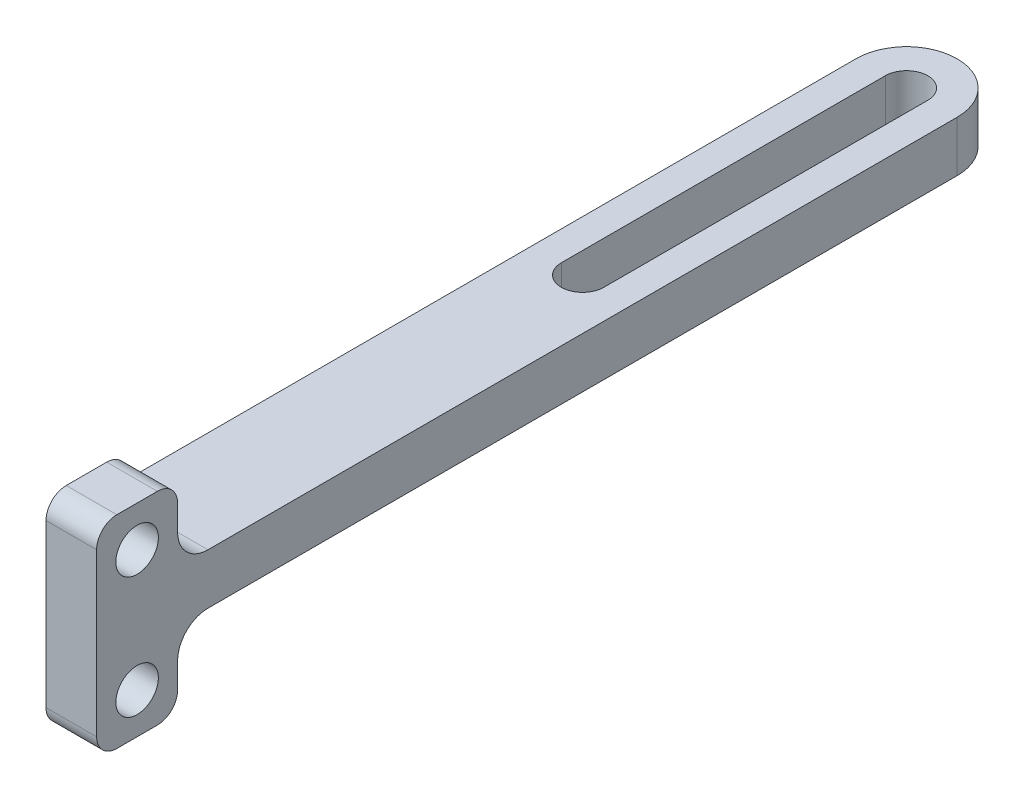
ISO-10303-21;
HEADER;
FILE_DESCRIPTION(('STEP AP214'),'2;1');
FILE_NAME('part.step','',(''),(''),'','','');
FILE_SCHEMA(('AUTOMOTIVE_DESIGN { 1 0 10303 214 1 1 1 1 }'));
ENDSEC;
DATA;
#1=APPLICATION_CONTEXT('core data for automotive mechanical design processes');
#2=APPLICATION_PROTOCOL_DEFINITION('international standard','automotive_design',2000,#1);
#3=PRODUCT_CONTEXT('',#1,'mechanical');
#4=PRODUCT('Part','Part','',(#3));
#5=PRODUCT_RELATED_PRODUCT_CATEGORY('part','',(#4));
#6=PRODUCT_DEFINITION_FORMATION('','',#4);
#7=PRODUCT_DEFINITION_CONTEXT('part definition',#1,'design');
#8=PRODUCT_DEFINITION('design','',#6,#7);
#9=PRODUCT_DEFINITION_SHAPE('','',#8);
#10=(LENGTH_UNIT() NAMED_UNIT(*) SI_UNIT(.MILLI.,.METRE.));
#11=(NAMED_UNIT(*) PLANE_ANGLE_UNIT() SI_UNIT($,.RADIAN.));
#12=(NAMED_UNIT(*) SI_UNIT($,.STERADIAN.) SOLID_ANGLE_UNIT());
#13=UNCERTAINTY_MEASURE_WITH_UNIT(LENGTH_MEASURE(1.E-05),#10,'distance_accuracy_value','');
#14=(GEOMETRIC_REPRESENTATION_CONTEXT(3) GLOBAL_UNCERTAINTY_ASSIGNED_CONTEXT((#13)) GLOBAL_UNIT_ASSIGNED_CONTEXT((#10,
#11,#12)) REPRESENTATION_CONTEXT('',''));
#15=CARTESIAN_POINT('',(0.,0.,0.));
#16=DIRECTION('',(0.,0.,1.));
#17=DIRECTION('',(1.,0.,0.));
#18=AXIS2_PLACEMENT_3D('',#15,#16,#17);
#19=CARTESIAN_POINT('',(-5.,5.,0.));
#20=DIRECTION('',(1.,0.,0.));
#21=DIRECTION('',(0.,0.,-1.));
#22=AXIS2_PLACEMENT_3D('',#19,#20,#21);
#23=PLANE('',#22);
#24=DIRECTION('',(0.,0.,1.));
#25=VECTOR('',#24,1.);
#26=CARTESIAN_POINT('',(-5.,0.,0.));
#27=LINE('',#26,#25);
#28=CARTESIAN_POINT('',(-5.,0.,-32.));
#29=VERTEX_POINT('',#28);
#30=CARTESIAN_POINT('',(-5.,0.,39.));
#31=VERTEX_POINT('',#30);
#32=EDGE_CURVE('E280',#29,#31,#27,.T.);
#33=ORIENTED_EDGE('',*,*,#32,.T.);
#34=DIRECTION('',(0.,-1.,0.));
#35=VECTOR('',#34,1.);
#36=CARTESIAN_POINT('',(-5.,5.,39.));
#37=LINE('',#36,#35);
#38=CARTESIAN_POINT('',(-5.,5.,39.));
#39=VERTEX_POINT('',#38);
#40=EDGE_CURVE('E332',#31,#39,#37,.F.);
#41=ORIENTED_EDGE('',*,*,#40,.T.);
#42=DIRECTION('',(0.,0.,1.));
#43=VECTOR('',#42,1.);
#44=CARTESIAN_POINT('',(-5.,5.,-32.));
#45=LINE('',#44,#43);
#46=CARTESIAN_POINT('',(-5.,5.,-32.));
#47=VERTEX_POINT('',#46);
#48=EDGE_CURVE('E272',#47,#39,#45,.T.);
#49=ORIENTED_EDGE('',*,*,#48,.F.);
#50=DIRECTION('',(0.,-1.,0.));
#51=VECTOR('',#50,1.);
#52=CARTESIAN_POINT('',(-5.,5.,-32.));
#53=LINE('',#52,#51);
#54=EDGE_CURVE('E285',#47,#29,#53,.T.);
#55=ORIENTED_EDGE('',*,*,#54,.T.);
#56=EDGE_LOOP('',(#33,#41,#49,#55));
#57=FACE_BOUND('',#56,.T.);
#58=ADVANCED_FACE('F33',(#57),#23,.F.);
#59=CARTESIAN_POINT('',(0.,5.,-32.));
#60=DIRECTION('',(0.,1.,0.));
#61=DIRECTION('',(0.,0.,1.));
#62=AXIS2_PLACEMENT_3D('',#59,#60,#61);
#63=PLANE('',#62);
#64=ORIENTED_EDGE('',*,*,#48,.T.);
#65=CARTESIAN_POINT('',(-2.,5.,39.));
#66=DIRECTION('',(0.,1.,0.));
#67=DIRECTION('',(0.,0.,1.));
#68=AXIS2_PLACEMENT_3D('',#65,#66,#67);
#69=CIRCLE('',#68,3.);
#70=CARTESIAN_POINT('',(-2.,5.,42.));
#71=VERTEX_POINT('',#70);
#72=EDGE_CURVE('E202',#39,#71,#69,.T.);
#73=ORIENTED_EDGE('',*,*,#72,.T.);
#74=DIRECTION('',(-1.,0.,0.));
#75=VECTOR('',#74,1.);
#76=CARTESIAN_POINT('',(-4.99999999999999,5.,42.));
#77=LINE('',#76,#75);
#78=CARTESIAN_POINT('',(0.,5.,42.));
#79=VERTEX_POINT('',#78);
#80=EDGE_CURVE('E192',#79,#71,#77,.T.);
#81=ORIENTED_EDGE('',*,*,#80,.F.);
#82=DIRECTION('',(1.,0.,0.));
#83=VECTOR('',#82,1.);
#84=CARTESIAN_POINT('',(5.,5.,42.));
#85=LINE('',#84,#83);
#86=CARTESIAN_POINT('',(5.,5.,42.));
#87=VERTEX_POINT('',#86);
#88=EDGE_CURVE('E334',#79,#87,#85,.T.);
#89=ORIENTED_EDGE('',*,*,#88,.T.);
#90=DIRECTION('',(0.,0.,-1.));
#91=VECTOR('',#90,1.);
#92=CARTESIAN_POINT('',(5.,5.,45.));
#93=LINE('',#92,#91);
#94=CARTESIAN_POINT('',(5.,5.,-32.));
#95=VERTEX_POINT('',#94);
#96=EDGE_CURVE('E275',#87,#95,#93,.T.);
#97=ORIENTED_EDGE('',*,*,#96,.T.);
#98=CARTESIAN_POINT('',(0.,5.,-32.));
#99=DIRECTION('',(0.,1.,0.));
#100=DIRECTION('',(0.,0.,1.));
#101=AXIS2_PLACEMENT_3D('',#98,#99,#100);
#102=CIRCLE('',#101,5.);
#103=EDGE_CURVE('E269',#95,#47,#102,.T.);
#104=ORIENTED_EDGE('',*,*,#103,.T.);
#105=EDGE_LOOP('',(#64,#73,#81,#89,#97,#104));
#106=FACE_BOUND('',#105,.T.);
#107=DIRECTION('',(0.,0.,1.));
#108=VECTOR('',#107,1.);
#109=CARTESIAN_POINT('',(-2.1,5.,-32.));
#110=LINE('',#109,#108);
#111=CARTESIAN_POINT('',(-2.1,5.,-32.));
#112=VERTEX_POINT('',#111);
#113=CARTESIAN_POINT('',(-2.1,5.,0.));
#114=VERTEX_POINT('',#113);
#115=EDGE_CURVE('E240',#112,#114,#110,.T.);
#116=ORIENTED_EDGE('',*,*,#115,.F.);
#117=CARTESIAN_POINT('',(0.,5.,-32.));
#118=DIRECTION('',(0.,1.,0.));
#119=DIRECTION('',(0.,0.,1.));
#120=AXIS2_PLACEMENT_3D('',#117,#118,#119);
#121=CIRCLE('',#120,2.1);
#122=CARTESIAN_POINT('',(2.1,5.,-32.));
#123=VERTEX_POINT('',#122);
#124=EDGE_CURVE('E238',#123,#112,#121,.T.);
#125=ORIENTED_EDGE('',*,*,#124,.F.);
#126=DIRECTION('',(0.,0.,-1.));
#127=VECTOR('',#126,1.);
#128=CARTESIAN_POINT('',(2.1,5.,-32.));
#129=LINE('',#128,#127);
#130=CARTESIAN_POINT('',(2.1,5.,0.));
#131=VERTEX_POINT('',#130);
#132=EDGE_CURVE('E246',#131,#123,#129,.T.);
#133=ORIENTED_EDGE('',*,*,#132,.F.);
#134=CARTESIAN_POINT('',(0.,5.,0.));
#135=DIRECTION('',(0.,1.,0.));
#136=DIRECTION('',(0.,0.,1.));
#137=AXIS2_PLACEMENT_3D('',#134,#135,#136);
#138=CIRCLE('',#137,2.1);
#139=EDGE_CURVE('E243',#114,#131,#138,.T.);
#140=ORIENTED_EDGE('',*,*,#139,.F.);
#141=EDGE_LOOP('',(#116,#125,#133,#140));
#142=FACE_BOUND('',#141,.T.);
#143=ADVANCED_FACE('F338',(#106,#142),#63,.T.);
#144=CARTESIAN_POINT('',(0.,0.,-32.));
#145=DIRECTION('',(0.,1.,0.));
#146=DIRECTION('',(0.,0.,1.));
#147=AXIS2_PLACEMENT_3D('',#144,#145,#146);
#148=PLANE('',#147);
#149=DIRECTION('',(1.,0.,0.));
#150=VECTOR('',#149,1.);
#151=CARTESIAN_POINT('',(-4.99999999999999,0.,42.));
#152=LINE('',#151,#150);
#153=CARTESIAN_POINT('',(-2.,0.,42.));
#154=VERTEX_POINT('',#153);
#155=CARTESIAN_POINT('',(0.,0.,42.));
#156=VERTEX_POINT('',#155);
#157=EDGE_CURVE('E173',#154,#156,#152,.T.);
#158=ORIENTED_EDGE('',*,*,#157,.F.);
#159=CARTESIAN_POINT('',(-2.,0.,39.));
#160=DIRECTION('',(0.,1.,0.));
#161=DIRECTION('',(0.,0.,1.));
#162=AXIS2_PLACEMENT_3D('',#159,#160,#161);
#163=CIRCLE('',#162,3.);
#164=EDGE_CURVE('E176',#154,#31,#163,.F.);
#165=ORIENTED_EDGE('',*,*,#164,.T.);
#166=ORIENTED_EDGE('',*,*,#32,.F.);
#167=CARTESIAN_POINT('',(0.,0.,-32.));
#168=DIRECTION('',(0.,1.,0.));
#169=DIRECTION('',(0.,0.,1.));
#170=AXIS2_PLACEMENT_3D('',#167,#168,#169);
#171=CIRCLE('',#170,5.);
#172=CARTESIAN_POINT('',(5.,0.,-32.));
#173=VERTEX_POINT('',#172);
#174=EDGE_CURVE('E268',#173,#29,#171,.T.);
#175=ORIENTED_EDGE('',*,*,#174,.F.);
#176=DIRECTION('',(0.,0.,-1.));
#177=VECTOR('',#176,1.);
#178=CARTESIAN_POINT('',(5.,0.,-32.));
#179=LINE('',#178,#177);
#180=CARTESIAN_POINT('',(5.,0.,42.));
#181=VERTEX_POINT('',#180);
#182=EDGE_CURVE('E175',#181,#173,#179,.T.);
#183=ORIENTED_EDGE('',*,*,#182,.F.);
#184=DIRECTION('',(1.,0.,0.));
#185=VECTOR('',#184,1.);
#186=CARTESIAN_POINT('',(0.,0.,42.));
#187=LINE('',#186,#185);
#188=EDGE_CURVE('E169',#181,#156,#187,.F.);
#189=ORIENTED_EDGE('',*,*,#188,.T.);
#190=EDGE_LOOP('',(#158,#165,#166,#175,#183,#189));
#191=FACE_BOUND('',#190,.T.);
#192=CARTESIAN_POINT('',(0.,0.,-32.));
#193=DIRECTION('',(0.,1.,0.));
#194=DIRECTION('',(0.,0.,1.));
#195=AXIS2_PLACEMENT_3D('',#192,#193,#194);
#196=CIRCLE('',#195,2.1);
#197=CARTESIAN_POINT('',(2.1,0.,-32.));
#198=VERTEX_POINT('',#197);
#199=CARTESIAN_POINT('',(-2.1,0.,-32.));
#200=VERTEX_POINT('',#199);
#201=EDGE_CURVE('E237',#198,#200,#196,.T.);
#202=ORIENTED_EDGE('',*,*,#201,.T.);
#203=DIRECTION('',(0.,0.,1.));
#204=VECTOR('',#203,1.);
#205=CARTESIAN_POINT('',(-2.1,0.,-32.));
#206=LINE('',#205,#204);
#207=CARTESIAN_POINT('',(-2.1,0.,0.));
#208=VERTEX_POINT('',#207);
#209=EDGE_CURVE('E251',#200,#208,#206,.T.);
#210=ORIENTED_EDGE('',*,*,#209,.T.);
#211=CARTESIAN_POINT('',(0.,0.,0.));
#212=DIRECTION('',(0.,1.,0.));
#213=DIRECTION('',(0.,0.,1.));
#214=AXIS2_PLACEMENT_3D('',#211,#212,#213);
#215=CIRCLE('',#214,2.1);
#216=CARTESIAN_POINT('',(2.1,0.,0.));
#217=VERTEX_POINT('',#216);
#218=EDGE_CURVE('E254',#208,#217,#215,.T.);
#219=ORIENTED_EDGE('',*,*,#218,.T.);
#220=DIRECTION('',(0.,0.,-1.));
#221=VECTOR('',#220,1.);
#222=CARTESIAN_POINT('',(2.1,0.,-32.));
#223=LINE('',#222,#221);
#224=EDGE_CURVE('E241',#217,#198,#223,.T.);
#225=ORIENTED_EDGE('',*,*,#224,.T.);
#226=EDGE_LOOP('',(#202,#210,#219,#225));
#227=FACE_BOUND('',#226,.T.);
#228=ADVANCED_FACE('F171',(#191,#227),#148,.F.);
#229=CARTESIAN_POINT('',(0.,5.,-32.));
#230=DIRECTION('',(0.,-1.,0.));
#231=DIRECTION('',(0.,0.,-1.));
#232=AXIS2_PLACEMENT_3D('',#229,#230,#231);
#233=CYLINDRICAL_SURFACE('',#232,5.);
#234=ORIENTED_EDGE('',*,*,#174,.T.);
#235=ORIENTED_EDGE('',*,*,#54,.F.);
#236=ORIENTED_EDGE('',*,*,#103,.F.);
#237=DIRECTION('',(0.,-1.,0.));
#238=VECTOR('',#237,1.);
#239=CARTESIAN_POINT('',(5.,5.,-32.));
#240=LINE('',#239,#238);
#241=EDGE_CURVE('E277',#95,#173,#240,.T.);
#242=ORIENTED_EDGE('',*,*,#241,.T.);
#243=EDGE_LOOP('',(#234,#235,#236,#242));
#244=FACE_BOUND('',#243,.T.);
#245=ADVANCED_FACE('F350',(#244),#233,.T.);
#246=CARTESIAN_POINT('',(5.,5.,-32.));
#247=DIRECTION('',(-1.,0.,0.));
#248=DIRECTION('',(0.,0.,1.));
#249=AXIS2_PLACEMENT_3D('',#246,#247,#248);
#250=PLANE('',#249);
#251=CARTESIAN_POINT('',(5.,8.5,49.));
#252=DIRECTION('',(1.,0.,0.));
#253=DIRECTION('',(0.,0.,-1.));
#254=AXIS2_PLACEMENT_3D('',#251,#252,#253);
#255=CIRCLE('',#254,2.1);
#256=CARTESIAN_POINT('',(5.,8.5,46.9));
#257=VERTEX_POINT('',#256);
#258=EDGE_CURVE('E292',#257,#257,#255,.T.);
#259=ORIENTED_EDGE('',*,*,#258,.F.);
#260=EDGE_LOOP('',(#259));
#261=FACE_BOUND('',#260,.T.);
#262=CARTESIAN_POINT('',(5.,-3.5,49.));
#263=DIRECTION('',(1.,0.,0.));
#264=DIRECTION('',(0.,0.,-1.));
#265=AXIS2_PLACEMENT_3D('',#262,#263,#264);
#266=CIRCLE('',#265,2.1);
#267=CARTESIAN_POINT('',(5.,-3.5,46.9));
#268=VERTEX_POINT('',#267);
#269=EDGE_CURVE('E343',#268,#268,#266,.T.);
#270=ORIENTED_EDGE('',*,*,#269,.F.);
#271=EDGE_LOOP('',(#270));
#272=FACE_BOUND('',#271,.T.);
#273=DIRECTION('',(0.,0.,-1.));
#274=VECTOR('',#273,1.);
#275=CARTESIAN_POINT('',(5.,-7.5,53.));
#276=LINE('',#275,#274);
#277=CARTESIAN_POINT('',(5.,-7.5,51.));
#278=VERTEX_POINT('',#277);
#279=CARTESIAN_POINT('',(5.,-7.5,47.));
#280=VERTEX_POINT('',#279);
#281=EDGE_CURVE('E226',#278,#280,#276,.T.);
#282=ORIENTED_EDGE('',*,*,#281,.T.);
#283=CARTESIAN_POINT('',(5.,-5.5,47.));
#284=DIRECTION('',(-1.,0.,0.));
#285=DIRECTION('',(0.,0.,1.));
#286=AXIS2_PLACEMENT_3D('',#283,#284,#285);
#287=CIRCLE('',#286,2.);
#288=CARTESIAN_POINT('',(5.,-5.5,45.));
#289=VERTEX_POINT('',#288);
#290=EDGE_CURVE('E212',#280,#289,#287,.F.);
#291=ORIENTED_EDGE('',*,*,#290,.T.);
#292=DIRECTION('',(0.,1.,0.));
#293=VECTOR('',#292,1.);
#294=CARTESIAN_POINT('',(5.,-7.5,45.));
#295=LINE('',#294,#293);
#296=CARTESIAN_POINT('',(5.,-3.,45.));
#297=VERTEX_POINT('',#296);
#298=EDGE_CURVE('E211',#289,#297,#295,.T.);
#299=ORIENTED_EDGE('',*,*,#298,.T.);
#300=CARTESIAN_POINT('',(5.,-3.,42.));
#301=DIRECTION('',(-1.,0.,0.));
#302=DIRECTION('',(0.,0.,1.));
#303=AXIS2_PLACEMENT_3D('',#300,#301,#302);
#304=CIRCLE('',#303,3.);
#305=EDGE_CURVE('E41',#297,#181,#304,.T.);
#306=ORIENTED_EDGE('',*,*,#305,.T.);
#307=ORIENTED_EDGE('',*,*,#182,.T.);
#308=ORIENTED_EDGE('',*,*,#241,.F.);
#309=ORIENTED_EDGE('',*,*,#96,.F.);
#310=CARTESIAN_POINT('',(5.,8.,42.));
#311=DIRECTION('',(-1.,0.,0.));
#312=DIRECTION('',(0.,0.,1.));
#313=AXIS2_PLACEMENT_3D('',#310,#311,#312);
#314=CIRCLE('',#313,3.);
#315=CARTESIAN_POINT('',(5.,8.,45.));
#316=VERTEX_POINT('',#315);
#317=EDGE_CURVE('E198',#87,#316,#314,.T.);
#318=ORIENTED_EDGE('',*,*,#317,.T.);
#319=CARTESIAN_POINT('',(5.,10.5,45.));
#320=VERTEX_POINT('',#319);
#321=EDGE_CURVE('E216',#316,#320,#295,.T.);
#322=ORIENTED_EDGE('',*,*,#321,.T.);
#323=CARTESIAN_POINT('',(5.,10.5,47.));
#324=DIRECTION('',(-1.,0.,0.));
#325=DIRECTION('',(0.,0.,1.));
#326=AXIS2_PLACEMENT_3D('',#323,#324,#325);
#327=CIRCLE('',#326,2.);
#328=CARTESIAN_POINT('',(5.,12.5,47.));
#329=VERTEX_POINT('',#328);
#330=EDGE_CURVE('E301',#320,#329,#327,.F.);
#331=ORIENTED_EDGE('',*,*,#330,.T.);
#332=DIRECTION('',(0.,0.,-1.));
#333=VECTOR('',#332,1.);
#334=CARTESIAN_POINT('',(5.,12.5,53.));
#335=LINE('',#334,#333);
#336=CARTESIAN_POINT('',(5.,12.5,51.));
#337=VERTEX_POINT('',#336);
#338=EDGE_CURVE('E234',#337,#329,#335,.T.);
#339=ORIENTED_EDGE('',*,*,#338,.F.);
#340=CARTESIAN_POINT('',(5.,10.5,51.));
#341=DIRECTION('',(-1.,0.,0.));
#342=DIRECTION('',(0.,0.,1.));
#343=AXIS2_PLACEMENT_3D('',#340,#341,#342);
#344=CIRCLE('',#343,2.);
#345=CARTESIAN_POINT('',(5.,10.5,53.));
#346=VERTEX_POINT('',#345);
#347=EDGE_CURVE('E299',#337,#346,#344,.F.);
#348=ORIENTED_EDGE('',*,*,#347,.T.);
#349=DIRECTION('',(0.,1.,0.));
#350=VECTOR('',#349,1.);
#351=CARTESIAN_POINT('',(5.,-7.5,53.));
#352=LINE('',#351,#350);
#353=CARTESIAN_POINT('',(5.,-5.5,53.));
#354=VERTEX_POINT('',#353);
#355=EDGE_CURVE('E225',#354,#346,#352,.T.);
#356=ORIENTED_EDGE('',*,*,#355,.F.);
#357=CARTESIAN_POINT('',(5.,-5.5,51.));
#358=DIRECTION('',(-1.,0.,0.));
#359=DIRECTION('',(0.,0.,1.));
#360=AXIS2_PLACEMENT_3D('',#357,#358,#359);
#361=CIRCLE('',#360,2.);
#362=EDGE_CURVE('E303',#354,#278,#361,.F.);
#363=ORIENTED_EDGE('',*,*,#362,.T.);
#364=EDGE_LOOP('',(#282,#291,#299,#306,#307,#308,#309,#318,#322,#331,#339,#348,#356,#363));
#365=FACE_BOUND('',#364,.T.);
#366=ADVANCED_FACE('F208',(#261,#272,#365),#250,.F.);
#367=CARTESIAN_POINT('',(0.,5.,-32.));
#368=DIRECTION('',(0.,-1.,0.));
#369=DIRECTION('',(0.,0.,-1.));
#370=AXIS2_PLACEMENT_3D('',#367,#368,#369);
#371=CYLINDRICAL_SURFACE('',#370,2.1);
#372=ORIENTED_EDGE('',*,*,#201,.F.);
#373=DIRECTION('',(0.,-1.,0.));
#374=VECTOR('',#373,1.);
#375=CARTESIAN_POINT('',(2.1,5.,-32.));
#376=LINE('',#375,#374);
#377=EDGE_CURVE('E248',#123,#198,#376,.T.);
#378=ORIENTED_EDGE('',*,*,#377,.F.);
#379=ORIENTED_EDGE('',*,*,#124,.T.);
#380=DIRECTION('',(0.,-1.,0.));
#381=VECTOR('',#380,1.);
#382=CARTESIAN_POINT('',(-2.1,5.,-32.));
#383=LINE('',#382,#381);
#384=EDGE_CURVE('E265',#112,#200,#383,.T.);
#385=ORIENTED_EDGE('',*,*,#384,.T.);
#386=EDGE_LOOP('',(#372,#378,#379,#385));
#387=FACE_BOUND('',#386,.T.);
#388=ADVANCED_FACE('F393',(#387),#371,.F.);
#389=CARTESIAN_POINT('',(-2.1,5.,-32.));
#390=DIRECTION('',(1.,0.,0.));
#391=DIRECTION('',(0.,0.,-1.));
#392=AXIS2_PLACEMENT_3D('',#389,#390,#391);
#393=PLANE('',#392);
#394=ORIENTED_EDGE('',*,*,#209,.F.);
#395=ORIENTED_EDGE('',*,*,#384,.F.);
#396=ORIENTED_EDGE('',*,*,#115,.T.);
#397=DIRECTION('',(0.,-1.,0.));
#398=VECTOR('',#397,1.);
#399=CARTESIAN_POINT('',(-2.1,5.,0.));
#400=LINE('',#399,#398);
#401=EDGE_CURVE('E263',#114,#208,#400,.T.);
#402=ORIENTED_EDGE('',*,*,#401,.T.);
#403=EDGE_LOOP('',(#394,#395,#396,#402));
#404=FACE_BOUND('',#403,.T.);
#405=ADVANCED_FACE('F587',(#404),#393,.T.);
#406=CARTESIAN_POINT('',(0.,5.,0.));
#407=DIRECTION('',(0.,-1.,0.));
#408=DIRECTION('',(0.,0.,-1.));
#409=AXIS2_PLACEMENT_3D('',#406,#407,#408);
#410=CYLINDRICAL_SURFACE('',#409,2.1);
#411=ORIENTED_EDGE('',*,*,#218,.F.);
#412=ORIENTED_EDGE('',*,*,#401,.F.);
#413=ORIENTED_EDGE('',*,*,#139,.T.);
#414=DIRECTION('',(0.,-1.,0.));
#415=VECTOR('',#414,1.);
#416=CARTESIAN_POINT('',(2.1,5.,0.));
#417=LINE('',#416,#415);
#418=EDGE_CURVE('E261',#131,#217,#417,.T.);
#419=ORIENTED_EDGE('',*,*,#418,.T.);
#420=EDGE_LOOP('',(#411,#412,#413,#419));
#421=FACE_BOUND('',#420,.T.);
#422=ADVANCED_FACE('F577',(#421),#410,.F.);
#423=CARTESIAN_POINT('',(2.1,5.,-32.));
#424=DIRECTION('',(-1.,0.,0.));
#425=DIRECTION('',(0.,0.,1.));
#426=AXIS2_PLACEMENT_3D('',#423,#424,#425);
#427=PLANE('',#426);
#428=ORIENTED_EDGE('',*,*,#224,.F.);
#429=ORIENTED_EDGE('',*,*,#418,.F.);
#430=ORIENTED_EDGE('',*,*,#132,.T.);
#431=ORIENTED_EDGE('',*,*,#377,.T.);
#432=EDGE_LOOP('',(#428,#429,#430,#431));
#433=FACE_BOUND('',#432,.T.);
#434=ADVANCED_FACE('F488',(#433),#427,.T.);
#435=CARTESIAN_POINT('',(0.,0.,45.));
#436=DIRECTION('',(0.,0.,-1.));
#437=DIRECTION('',(-1.,0.,0.));
#438=AXIS2_PLACEMENT_3D('',#435,#436,#437);
#439=PLANE('',#438);
#440=ORIENTED_EDGE('',*,*,#321,.F.);
#441=DIRECTION('',(1.,0.,0.));
#442=VECTOR('',#441,1.);
#443=CARTESIAN_POINT('',(0.,8.,45.));
#444=LINE('',#443,#442);
#445=CARTESIAN_POINT('',(0.,8.,45.));
#446=VERTEX_POINT('',#445);
#447=EDGE_CURVE('E199',#316,#446,#444,.F.);
#448=ORIENTED_EDGE('',*,*,#447,.T.);
#449=DIRECTION('',(0.,-1.,0.));
#450=VECTOR('',#449,1.);
#451=CARTESIAN_POINT('',(0.,12.5,45.));
#452=LINE('',#451,#450);
#453=CARTESIAN_POINT('',(0.,10.5,45.));
#454=VERTEX_POINT('',#453);
#455=EDGE_CURVE('E218',#454,#446,#452,.T.);
#456=ORIENTED_EDGE('',*,*,#455,.F.);
#457=DIRECTION('',(-1.,0.,0.));
#458=VECTOR('',#457,1.);
#459=CARTESIAN_POINT('',(5.,10.5,45.));
#460=LINE('',#459,#458);
#461=EDGE_CURVE('E327',#454,#320,#460,.F.);
#462=ORIENTED_EDGE('',*,*,#461,.T.);
#463=EDGE_LOOP('',(#440,#448,#456,#462));
#464=FACE_BOUND('',#463,.T.);
#465=ADVANCED_FACE('F358',(#464),#439,.T.);
#466=CARTESIAN_POINT('',(0.,12.5,53.));
#467=DIRECTION('',(0.,-1.,0.));
#468=DIRECTION('',(0.,0.,-1.));
#469=AXIS2_PLACEMENT_3D('',#466,#467,#468);
#470=PLANE('',#469);
#471=ORIENTED_EDGE('',*,*,#338,.T.);
#472=DIRECTION('',(-1.,0.,0.));
#473=VECTOR('',#472,1.);
#474=CARTESIAN_POINT('',(0.,12.5,47.));
#475=LINE('',#474,#473);
#476=CARTESIAN_POINT('',(0.,12.5,47.));
#477=VERTEX_POINT('',#476);
#478=EDGE_CURVE('E324',#329,#477,#475,.T.);
#479=ORIENTED_EDGE('',*,*,#478,.T.);
#480=DIRECTION('',(0.,0.,-1.));
#481=VECTOR('',#480,1.);
#482=CARTESIAN_POINT('',(0.,12.5,53.));
#483=LINE('',#482,#481);
#484=CARTESIAN_POINT('',(0.,12.5,51.));
#485=VERTEX_POINT('',#484);
#486=EDGE_CURVE('E231',#485,#477,#483,.T.);
#487=ORIENTED_EDGE('',*,*,#486,.F.);
#488=DIRECTION('',(-1.,0.,0.));
#489=VECTOR('',#488,1.);
#490=CARTESIAN_POINT('',(0.,12.5,51.));
#491=LINE('',#490,#489);
#492=EDGE_CURVE('E322',#485,#337,#491,.F.);
#493=ORIENTED_EDGE('',*,*,#492,.T.);
#494=EDGE_LOOP('',(#471,#479,#487,#493));
#495=FACE_BOUND('',#494,.T.);
#496=ADVANCED_FACE('F366',(#495),#470,.F.);
#497=CARTESIAN_POINT('',(0.,12.5,53.));
#498=DIRECTION('',(1.,0.,0.));
#499=DIRECTION('',(0.,0.,-1.));
#500=AXIS2_PLACEMENT_3D('',#497,#498,#499);
#501=PLANE('',#500);
#502=CARTESIAN_POINT('',(0.,8.5,49.));
#503=DIRECTION('',(1.,0.,0.));
#504=DIRECTION('',(0.,0.,-1.));
#505=AXIS2_PLACEMENT_3D('',#502,#503,#504);
#506=CIRCLE('',#505,2.1);
#507=CARTESIAN_POINT('',(0.,8.5,46.9));
#508=VERTEX_POINT('',#507);
#509=EDGE_CURVE('E220',#508,#508,#506,.T.);
#510=ORIENTED_EDGE('',*,*,#509,.T.);
#511=EDGE_LOOP('',(#510));
#512=FACE_BOUND('',#511,.T.);
#513=CARTESIAN_POINT('',(0.,-3.5,49.));
#514=DIRECTION('',(1.,0.,0.));
#515=DIRECTION('',(0.,0.,-1.));
#516=AXIS2_PLACEMENT_3D('',#513,#514,#515);
#517=CIRCLE('',#516,2.1);
#518=CARTESIAN_POINT('',(0.,-3.5,46.9));
#519=VERTEX_POINT('',#518);
#520=EDGE_CURVE('E289',#519,#519,#517,.T.);
#521=ORIENTED_EDGE('',*,*,#520,.T.);
#522=EDGE_LOOP('',(#521));
#523=FACE_BOUND('',#522,.T.);
#524=DIRECTION('',(0.,1.,0.));
#525=VECTOR('',#524,1.);
#526=CARTESIAN_POINT('',(0.,5.,42.));
#527=LINE('',#526,#525);
#528=EDGE_CURVE('E184',#156,#79,#527,.T.);
#529=ORIENTED_EDGE('',*,*,#528,.F.);
#530=CARTESIAN_POINT('',(0.,-3.,42.));
#531=DIRECTION('',(1.,0.,0.));
#532=DIRECTION('',(0.,0.,-1.));
#533=AXIS2_PLACEMENT_3D('',#530,#531,#532);
#534=CIRCLE('',#533,3.);
#535=CARTESIAN_POINT('',(0.,-3.,45.));
#536=VERTEX_POINT('',#535);
#537=EDGE_CURVE('E11',#156,#536,#534,.T.);
#538=ORIENTED_EDGE('',*,*,#537,.T.);
#539=CARTESIAN_POINT('',(0.,-5.5,45.));
#540=VERTEX_POINT('',#539);
#541=EDGE_CURVE('E215',#536,#540,#452,.T.);
#542=ORIENTED_EDGE('',*,*,#541,.T.);
#543=CARTESIAN_POINT('',(0.,-5.5,47.));
#544=DIRECTION('',(1.,0.,0.));
#545=DIRECTION('',(0.,0.,-1.));
#546=AXIS2_PLACEMENT_3D('',#543,#544,#545);
#547=CIRCLE('',#546,2.);
#548=CARTESIAN_POINT('',(0.,-7.5,47.));
#549=VERTEX_POINT('',#548);
#550=EDGE_CURVE('E314',#540,#549,#547,.F.);
#551=ORIENTED_EDGE('',*,*,#550,.T.);
#552=DIRECTION('',(0.,0.,-1.));
#553=VECTOR('',#552,1.);
#554=CARTESIAN_POINT('',(0.,-7.5,53.));
#555=LINE('',#554,#553);
#556=CARTESIAN_POINT('',(0.,-7.5,51.));
#557=VERTEX_POINT('',#556);
#558=EDGE_CURVE('E228',#557,#549,#555,.T.);
#559=ORIENTED_EDGE('',*,*,#558,.F.);
#560=CARTESIAN_POINT('',(0.,-5.5,51.));
#561=DIRECTION('',(1.,0.,0.));
#562=DIRECTION('',(0.,0.,-1.));
#563=AXIS2_PLACEMENT_3D('',#560,#561,#562);
#564=CIRCLE('',#563,2.);
#565=CARTESIAN_POINT('',(0.,-5.5,53.));
#566=VERTEX_POINT('',#565);
#567=EDGE_CURVE('E312',#557,#566,#564,.F.);
#568=ORIENTED_EDGE('',*,*,#567,.T.);
#569=DIRECTION('',(0.,-1.,0.));
#570=VECTOR('',#569,1.);
#571=CARTESIAN_POINT('',(0.,12.5,53.));
#572=LINE('',#571,#570);
#573=CARTESIAN_POINT('',(0.,10.5,53.));
#574=VERTEX_POINT('',#573);
#575=EDGE_CURVE('E222',#574,#566,#572,.T.);
#576=ORIENTED_EDGE('',*,*,#575,.F.);
#577=CARTESIAN_POINT('',(0.,10.5,51.));
#578=DIRECTION('',(1.,0.,0.));
#579=DIRECTION('',(0.,0.,-1.));
#580=AXIS2_PLACEMENT_3D('',#577,#578,#579);
#581=CIRCLE('',#580,2.);
#582=EDGE_CURVE('E308',#574,#485,#581,.F.);
#583=ORIENTED_EDGE('',*,*,#582,.T.);
#584=ORIENTED_EDGE('',*,*,#486,.T.);
#585=CARTESIAN_POINT('',(0.,10.5,47.));
#586=DIRECTION('',(1.,0.,0.));
#587=DIRECTION('',(0.,0.,-1.));
#588=AXIS2_PLACEMENT_3D('',#585,#586,#587);
#589=CIRCLE('',#588,2.);
#590=EDGE_CURVE('E310',#477,#454,#589,.F.);
#591=ORIENTED_EDGE('',*,*,#590,.T.);
#592=ORIENTED_EDGE('',*,*,#455,.T.);
#593=CARTESIAN_POINT('',(0.,8.,42.));
#594=DIRECTION('',(1.,0.,0.));
#595=DIRECTION('',(0.,0.,-1.));
#596=AXIS2_PLACEMENT_3D('',#593,#594,#595);
#597=CIRCLE('',#596,3.);
#598=EDGE_CURVE('E191',#446,#79,#597,.T.);
#599=ORIENTED_EDGE('',*,*,#598,.T.);
#600=EDGE_LOOP('',(#529,#538,#542,#551,#559,#568,#576,#583,#584,#591,#592,#599));
#601=FACE_BOUND('',#600,.T.);
#602=ADVANCED_FACE('F188',(#512,#523,#601),#501,.F.);
#603=CARTESIAN_POINT('',(0.,-7.5,53.));
#604=DIRECTION('',(0.,1.,0.));
#605=DIRECTION('',(0.,0.,1.));
#606=AXIS2_PLACEMENT_3D('',#603,#604,#605);
#607=PLANE('',#606);
#608=ORIENTED_EDGE('',*,*,#558,.T.);
#609=DIRECTION('',(1.,0.,0.));
#610=VECTOR('',#609,1.);
#611=CARTESIAN_POINT('',(5.,-7.5,47.));
#612=LINE('',#611,#610);
#613=EDGE_CURVE('E296',#549,#280,#612,.T.);
#614=ORIENTED_EDGE('',*,*,#613,.T.);
#615=ORIENTED_EDGE('',*,*,#281,.F.);
#616=DIRECTION('',(1.,0.,0.));
#617=VECTOR('',#616,1.);
#618=CARTESIAN_POINT('',(0.,-7.5,51.));
#619=LINE('',#618,#617);
#620=EDGE_CURVE('E288',#278,#557,#619,.F.);
#621=ORIENTED_EDGE('',*,*,#620,.T.);
#622=EDGE_LOOP('',(#608,#614,#615,#621));
#623=FACE_BOUND('',#622,.T.);
#624=ADVANCED_FACE('F405',(#623),#607,.F.);
#625=CARTESIAN_POINT('',(0.,0.,53.));
#626=DIRECTION('',(0.,0.,-1.));
#627=DIRECTION('',(-1.,0.,0.));
#628=AXIS2_PLACEMENT_3D('',#625,#626,#627);
#629=PLANE('',#628);
#630=ORIENTED_EDGE('',*,*,#575,.T.);
#631=DIRECTION('',(1.,0.,0.));
#632=VECTOR('',#631,1.);
#633=CARTESIAN_POINT('',(0.,-5.5,53.));
#634=LINE('',#633,#632);
#635=EDGE_CURVE('E319',#566,#354,#634,.T.);
#636=ORIENTED_EDGE('',*,*,#635,.T.);
#637=ORIENTED_EDGE('',*,*,#355,.T.);
#638=DIRECTION('',(-1.,0.,0.));
#639=VECTOR('',#638,1.);
#640=CARTESIAN_POINT('',(0.,10.5,53.));
#641=LINE('',#640,#639);
#642=EDGE_CURVE('E316',#346,#574,#641,.T.);
#643=ORIENTED_EDGE('',*,*,#642,.T.);
#644=EDGE_LOOP('',(#630,#636,#637,#643));
#645=FACE_BOUND('',#644,.T.);
#646=ADVANCED_FACE('F378',(#645),#629,.F.);
#647=ORIENTED_EDGE('',*,*,#541,.F.);
#648=DIRECTION('',(1.,0.,0.));
#649=VECTOR('',#648,1.);
#650=CARTESIAN_POINT('',(0.,-3.,45.));
#651=LINE('',#650,#649);
#652=EDGE_CURVE('E194',#536,#297,#651,.T.);
#653=ORIENTED_EDGE('',*,*,#652,.T.);
#654=ORIENTED_EDGE('',*,*,#298,.F.);
#655=DIRECTION('',(1.,0.,0.));
#656=VECTOR('',#655,1.);
#657=CARTESIAN_POINT('',(0.,-5.5,45.));
#658=LINE('',#657,#656);
#659=EDGE_CURVE('E306',#289,#540,#658,.F.);
#660=ORIENTED_EDGE('',*,*,#659,.T.);
#661=EDGE_LOOP('',(#647,#653,#654,#660));
#662=FACE_BOUND('',#661,.T.);
#663=ADVANCED_FACE('F400',(#662),#439,.T.);
#664=CARTESIAN_POINT('',(-3.,-3.5,49.));
#665=DIRECTION('',(1.,0.,0.));
#666=DIRECTION('',(0.,0.,-1.));
#667=AXIS2_PLACEMENT_3D('',#664,#665,#666);
#668=CYLINDRICAL_SURFACE('',#667,2.1);
#669=ORIENTED_EDGE('',*,*,#269,.T.);
#670=EDGE_LOOP('',(#669));
#671=FACE_BOUND('',#670,.T.);
#672=ORIENTED_EDGE('',*,*,#520,.F.);
#673=EDGE_LOOP('',(#672));
#674=FACE_BOUND('',#673,.T.);
#675=ADVANCED_FACE('F397',(#671,#674),#668,.F.);
#676=CARTESIAN_POINT('',(-3.,8.5,49.));
#677=DIRECTION('',(1.,0.,0.));
#678=DIRECTION('',(0.,0.,-1.));
#679=AXIS2_PLACEMENT_3D('',#676,#677,#678);
#680=CYLINDRICAL_SURFACE('',#679,2.1);
#681=ORIENTED_EDGE('',*,*,#258,.T.);
#682=EDGE_LOOP('',(#681));
#683=FACE_BOUND('',#682,.T.);
#684=ORIENTED_EDGE('',*,*,#509,.F.);
#685=EDGE_LOOP('',(#684));
#686=FACE_BOUND('',#685,.T.);
#687=ADVANCED_FACE('F388',(#683,#686),#680,.F.);
#688=CARTESIAN_POINT('',(0.,-5.5,47.));
#689=DIRECTION('',(-1.,0.,0.));
#690=DIRECTION('',(0.,0.,1.));
#691=AXIS2_PLACEMENT_3D('',#688,#689,#690);
#692=CYLINDRICAL_SURFACE('',#691,2.);
#693=ORIENTED_EDGE('',*,*,#550,.F.);
#694=ORIENTED_EDGE('',*,*,#659,.F.);
#695=ORIENTED_EDGE('',*,*,#290,.F.);
#696=ORIENTED_EDGE('',*,*,#613,.F.);
#697=EDGE_LOOP('',(#693,#694,#695,#696));
#698=FACE_BOUND('',#697,.T.);
#699=ADVANCED_FACE('F425',(#698),#692,.T.);
#700=CARTESIAN_POINT('',(0.,-5.5,51.));
#701=DIRECTION('',(1.,0.,0.));
#702=DIRECTION('',(0.,0.,-1.));
#703=AXIS2_PLACEMENT_3D('',#700,#701,#702);
#704=CYLINDRICAL_SURFACE('',#703,2.);
#705=ORIENTED_EDGE('',*,*,#567,.F.);
#706=ORIENTED_EDGE('',*,*,#620,.F.);
#707=ORIENTED_EDGE('',*,*,#362,.F.);
#708=ORIENTED_EDGE('',*,*,#635,.F.);
#709=EDGE_LOOP('',(#705,#706,#707,#708));
#710=FACE_BOUND('',#709,.T.);
#711=ADVANCED_FACE('F428',(#710),#704,.T.);
#712=CARTESIAN_POINT('',(0.,10.5,47.));
#713=DIRECTION('',(1.,0.,0.));
#714=DIRECTION('',(0.,0.,-1.));
#715=AXIS2_PLACEMENT_3D('',#712,#713,#714);
#716=CYLINDRICAL_SURFACE('',#715,2.);
#717=ORIENTED_EDGE('',*,*,#330,.F.);
#718=ORIENTED_EDGE('',*,*,#461,.F.);
#719=ORIENTED_EDGE('',*,*,#590,.F.);
#720=ORIENTED_EDGE('',*,*,#478,.F.);
#721=EDGE_LOOP('',(#717,#718,#719,#720));
#722=FACE_BOUND('',#721,.T.);
#723=ADVANCED_FACE('F364',(#722),#716,.T.);
#724=CARTESIAN_POINT('',(0.,10.5,51.));
#725=DIRECTION('',(-1.,0.,0.));
#726=DIRECTION('',(0.,0.,1.));
#727=AXIS2_PLACEMENT_3D('',#724,#725,#726);
#728=CYLINDRICAL_SURFACE('',#727,2.);
#729=ORIENTED_EDGE('',*,*,#347,.F.);
#730=ORIENTED_EDGE('',*,*,#492,.F.);
#731=ORIENTED_EDGE('',*,*,#582,.F.);
#732=ORIENTED_EDGE('',*,*,#642,.F.);
#733=EDGE_LOOP('',(#729,#730,#731,#732));
#734=FACE_BOUND('',#733,.T.);
#735=ADVANCED_FACE('F374',(#734),#728,.T.);
#736=CARTESIAN_POINT('',(0.,0.,42.));
#737=DIRECTION('',(0.,0.,1.));
#738=DIRECTION('',(1.,0.,0.));
#739=AXIS2_PLACEMENT_3D('',#736,#737,#738);
#740=PLANE('',#739);
#741=ORIENTED_EDGE('',*,*,#80,.T.);
#742=DIRECTION('',(0.,-1.,0.));
#743=VECTOR('',#742,1.);
#744=CARTESIAN_POINT('',(-2.,0.,42.));
#745=LINE('',#744,#743);
#746=EDGE_CURVE('E177',#71,#154,#745,.T.);
#747=ORIENTED_EDGE('',*,*,#746,.T.);
#748=ORIENTED_EDGE('',*,*,#157,.T.);
#749=ORIENTED_EDGE('',*,*,#528,.T.);
#750=EDGE_LOOP('',(#741,#747,#748,#749));
#751=FACE_BOUND('',#750,.T.);
#752=ADVANCED_FACE('F183',(#751),#740,.T.);
#753=CARTESIAN_POINT('',(-2.,0.,39.));
#754=DIRECTION('',(0.,1.,0.));
#755=DIRECTION('',(0.,0.,1.));
#756=AXIS2_PLACEMENT_3D('',#753,#754,#755);
#757=CYLINDRICAL_SURFACE('',#756,3.);
#758=ORIENTED_EDGE('',*,*,#72,.F.);
#759=ORIENTED_EDGE('',*,*,#40,.F.);
#760=ORIENTED_EDGE('',*,*,#164,.F.);
#761=ORIENTED_EDGE('',*,*,#746,.F.);
#762=EDGE_LOOP('',(#758,#759,#760,#761));
#763=FACE_BOUND('',#762,.T.);
#764=ADVANCED_FACE('F345',(#763),#757,.T.);
#765=CARTESIAN_POINT('',(0.,8.,42.));
#766=DIRECTION('',(-1.,0.,0.));
#767=DIRECTION('',(0.,0.,1.));
#768=AXIS2_PLACEMENT_3D('',#765,#766,#767);
#769=CYLINDRICAL_SURFACE('',#768,3.);
#770=ORIENTED_EDGE('',*,*,#598,.F.);
#771=ORIENTED_EDGE('',*,*,#447,.F.);
#772=ORIENTED_EDGE('',*,*,#317,.F.);
#773=ORIENTED_EDGE('',*,*,#88,.F.);
#774=EDGE_LOOP('',(#770,#771,#772,#773));
#775=FACE_BOUND('',#774,.T.);
#776=ADVANCED_FACE('F354',(#775),#769,.F.);
#777=CARTESIAN_POINT('',(0.,-3.,42.));
#778=DIRECTION('',(1.,0.,0.));
#779=DIRECTION('',(0.,0.,-1.));
#780=AXIS2_PLACEMENT_3D('',#777,#778,#779);
#781=CYLINDRICAL_SURFACE('',#780,3.);
#782=ORIENTED_EDGE('',*,*,#537,.F.);
#783=ORIENTED_EDGE('',*,*,#188,.F.);
#784=ORIENTED_EDGE('',*,*,#305,.F.);
#785=ORIENTED_EDGE('',*,*,#652,.F.);
#786=EDGE_LOOP('',(#782,#783,#784,#785));
#787=FACE_BOUND('',#786,.T.);
#788=ADVANCED_FACE('F35',(#787),#781,.F.);
#789=CLOSED_SHELL('',(#58,#143,#228,#245,#366,#388,#405,#422,#434,#465,#496,#602,#624,#646,#663,
#675,#687,#699,#711,#723,#735,#752,#764,#776,#788));
#790=MANIFOLD_SOLID_BREP('B2',#789);
#791=ADVANCED_BREP_SHAPE_REPRESENTATION('',(#18,#790),#14);
#792=SHAPE_DEFINITION_REPRESENTATION(#9,#791);
ENDSEC;
END-ISO-10303-21;
